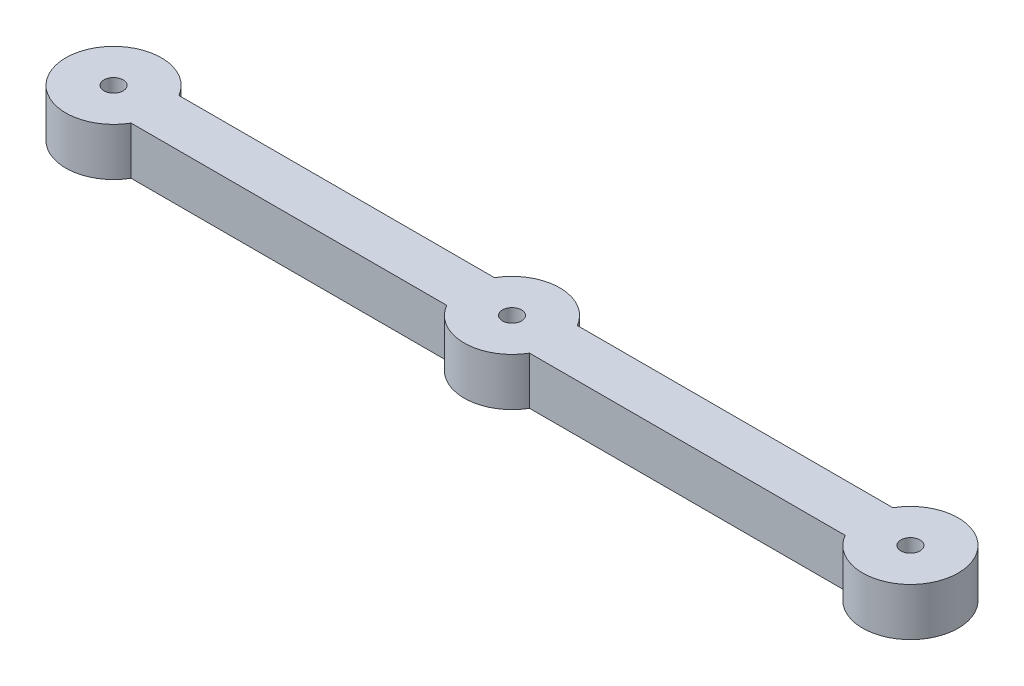
ISO-10303-21;
HEADER;
FILE_DESCRIPTION(('STEP AP214'),'2;1');
FILE_NAME('part.step','',(''),(''),'','','');
FILE_SCHEMA(('AUTOMOTIVE_DESIGN { 1 0 10303 214 1 1 1 1 }'));
ENDSEC;
DATA;
#1=APPLICATION_CONTEXT('core data for automotive mechanical design processes');
#2=APPLICATION_PROTOCOL_DEFINITION('international standard','automotive_design',2000,#1);
#3=PRODUCT_CONTEXT('',#1,'mechanical');
#4=PRODUCT('Part','Part','',(#3));
#5=PRODUCT_RELATED_PRODUCT_CATEGORY('part','',(#4));
#6=PRODUCT_DEFINITION_FORMATION('','',#4);
#7=PRODUCT_DEFINITION_CONTEXT('part definition',#1,'design');
#8=PRODUCT_DEFINITION('design','',#6,#7);
#9=PRODUCT_DEFINITION_SHAPE('','',#8);
#10=(LENGTH_UNIT() NAMED_UNIT(*) SI_UNIT(.MILLI.,.METRE.));
#11=(NAMED_UNIT(*) PLANE_ANGLE_UNIT() SI_UNIT($,.RADIAN.));
#12=(NAMED_UNIT(*) SI_UNIT($,.STERADIAN.) SOLID_ANGLE_UNIT());
#13=UNCERTAINTY_MEASURE_WITH_UNIT(LENGTH_MEASURE(1.E-05),#10,'distance_accuracy_value','');
#14=(GEOMETRIC_REPRESENTATION_CONTEXT(3) GLOBAL_UNCERTAINTY_ASSIGNED_CONTEXT((#13)) GLOBAL_UNIT_ASSIGNED_CONTEXT((#10,
#11,#12)) REPRESENTATION_CONTEXT('',''));
#15=CARTESIAN_POINT('',(0.,0.,0.));
#16=DIRECTION('',(0.,0.,1.));
#17=DIRECTION('',(1.,0.,0.));
#18=AXIS2_PLACEMENT_3D('',#15,#16,#17);
#19=CARTESIAN_POINT('',(-25.,0.,0.));
#20=DIRECTION('',(0.,1.,0.));
#21=DIRECTION('',(0.,0.,1.));
#22=AXIS2_PLACEMENT_3D('',#19,#20,#21);
#23=PLANE('',#22);
#24=CARTESIAN_POINT('',(-25.,0.,0.));
#25=DIRECTION('',(0.,-1.,0.));
#26=DIRECTION('',(0.,0.,-1.));
#27=AXIS2_PLACEMENT_3D('',#24,#25,#26);
#28=CIRCLE('',#27,1.5);
#29=CARTESIAN_POINT('',(-25.,0.,-1.5));
#30=VERTEX_POINT('',#29);
#31=EDGE_CURVE('E236',#30,#30,#28,.T.);
#32=ORIENTED_EDGE('',*,*,#31,.F.);
#33=EDGE_LOOP('',(#32));
#34=FACE_BOUND('',#33,.T.);
#35=CARTESIAN_POINT('',(0.,0.,0.));
#36=DIRECTION('',(0.,-1.,0.));
#37=DIRECTION('',(0.,0.,-1.));
#38=AXIS2_PLACEMENT_3D('',#35,#36,#37);
#39=CIRCLE('',#38,1.5);
#40=CARTESIAN_POINT('',(0.,0.,-1.5));
#41=VERTEX_POINT('',#40);
#42=EDGE_CURVE('E233',#41,#41,#39,.T.);
#43=ORIENTED_EDGE('',*,*,#42,.F.);
#44=EDGE_LOOP('',(#43));
#45=FACE_BOUND('',#44,.T.);
#46=CARTESIAN_POINT('',(25.,0.,0.));
#47=DIRECTION('',(0.,-1.,0.));
#48=DIRECTION('',(0.,0.,-1.));
#49=AXIS2_PLACEMENT_3D('',#46,#47,#48);
#50=CIRCLE('',#49,1.5);
#51=CARTESIAN_POINT('',(25.,0.,-1.5));
#52=VERTEX_POINT('',#51);
#53=EDGE_CURVE('E224',#52,#52,#50,.T.);
#54=ORIENTED_EDGE('',*,*,#53,.F.);
#55=EDGE_LOOP('',(#54));
#56=FACE_BOUND('',#55,.T.);
#57=CARTESIAN_POINT('',(25.,0.,0.));
#58=DIRECTION('',(0.,1.,0.));
#59=DIRECTION('',(0.,0.,1.));
#60=AXIS2_PLACEMENT_3D('',#57,#58,#59);
#61=CIRCLE('',#60,3.);
#62=CARTESIAN_POINT('',(22.4019237886467,0.,1.5));
#63=VERTEX_POINT('',#62);
#64=CARTESIAN_POINT('',(22.4019237886467,0.,-1.5));
#65=VERTEX_POINT('',#64);
#66=EDGE_CURVE('E202',#63,#65,#61,.T.);
#67=ORIENTED_EDGE('',*,*,#66,.F.);
#68=DIRECTION('',(1.,0.,0.));
#69=VECTOR('',#68,1.);
#70=CARTESIAN_POINT('',(-25.,0.,1.5));
#71=LINE('',#70,#69);
#72=CARTESIAN_POINT('',(2.59807621135332,0.,1.5));
#73=VERTEX_POINT('',#72);
#74=EDGE_CURVE('E190',#73,#63,#71,.T.);
#75=ORIENTED_EDGE('',*,*,#74,.F.);
#76=CARTESIAN_POINT('',(0.,0.,0.));
#77=DIRECTION('',(0.,1.,0.));
#78=DIRECTION('',(0.,0.,1.));
#79=AXIS2_PLACEMENT_3D('',#76,#77,#78);
#80=CIRCLE('',#79,3.);
#81=CARTESIAN_POINT('',(-2.59807621135332,0.,1.5));
#82=VERTEX_POINT('',#81);
#83=EDGE_CURVE('E197',#82,#73,#80,.T.);
#84=ORIENTED_EDGE('',*,*,#83,.F.);
#85=CARTESIAN_POINT('',(-22.4019237886467,0.,1.5));
#86=VERTEX_POINT('',#85);
#87=EDGE_CURVE('E177',#86,#82,#71,.T.);
#88=ORIENTED_EDGE('',*,*,#87,.F.);
#89=CARTESIAN_POINT('',(-25.,0.,0.));
#90=DIRECTION('',(0.,1.,0.));
#91=DIRECTION('',(0.,0.,1.));
#92=AXIS2_PLACEMENT_3D('',#89,#90,#91);
#93=CIRCLE('',#92,3.);
#94=CARTESIAN_POINT('',(-22.4019237886467,0.,-1.5));
#95=VERTEX_POINT('',#94);
#96=EDGE_CURVE('E160',#95,#86,#93,.T.);
#97=ORIENTED_EDGE('',*,*,#96,.F.);
#98=DIRECTION('',(1.,0.,0.));
#99=VECTOR('',#98,1.);
#100=CARTESIAN_POINT('',(-25.,0.,-1.5));
#101=LINE('',#100,#99);
#102=CARTESIAN_POINT('',(-2.59807621135332,0.,-1.5));
#103=VERTEX_POINT('',#102);
#104=EDGE_CURVE('E165',#95,#103,#101,.T.);
#105=ORIENTED_EDGE('',*,*,#104,.T.);
#106=CARTESIAN_POINT('',(2.59807621135332,0.,-1.5));
#107=VERTEX_POINT('',#106);
#108=EDGE_CURVE('E196',#107,#103,#80,.T.);
#109=ORIENTED_EDGE('',*,*,#108,.F.);
#110=EDGE_CURVE('E173',#107,#65,#101,.T.);
#111=ORIENTED_EDGE('',*,*,#110,.T.);
#112=EDGE_LOOP('',(#67,#75,#84,#88,#97,#105,#109,#111));
#113=FACE_BOUND('',#112,.T.);
#114=ADVANCED_FACE('F84',(#34,#45,#56,#113),#23,.F.);
#115=CARTESIAN_POINT('',(-25.,3.,0.));
#116=DIRECTION('',(0.,1.,0.));
#117=DIRECTION('',(0.,0.,1.));
#118=AXIS2_PLACEMENT_3D('',#115,#116,#117);
#119=PLANE('',#118);
#120=CARTESIAN_POINT('',(-25.,3.,0.));
#121=DIRECTION('',(0.,-1.,0.));
#122=DIRECTION('',(0.,0.,-1.));
#123=AXIS2_PLACEMENT_3D('',#120,#121,#122);
#124=CIRCLE('',#123,0.6);
#125=CARTESIAN_POINT('',(-25.,3.,-0.6));
#126=VERTEX_POINT('',#125);
#127=EDGE_CURVE('E244',#126,#126,#124,.T.);
#128=ORIENTED_EDGE('',*,*,#127,.T.);
#129=EDGE_LOOP('',(#128));
#130=FACE_BOUND('',#129,.T.);
#131=CARTESIAN_POINT('',(25.,3.,0.));
#132=DIRECTION('',(0.,-1.,0.));
#133=DIRECTION('',(0.,0.,-1.));
#134=AXIS2_PLACEMENT_3D('',#131,#132,#133);
#135=CIRCLE('',#134,0.6);
#136=CARTESIAN_POINT('',(25.,3.,-0.6));
#137=VERTEX_POINT('',#136);
#138=EDGE_CURVE('E243',#137,#137,#135,.T.);
#139=ORIENTED_EDGE('',*,*,#138,.T.);
#140=EDGE_LOOP('',(#139));
#141=FACE_BOUND('',#140,.T.);
#142=CARTESIAN_POINT('',(0.,3.,0.));
#143=DIRECTION('',(0.,-1.,0.));
#144=DIRECTION('',(0.,0.,-1.));
#145=AXIS2_PLACEMENT_3D('',#142,#143,#144);
#146=CIRCLE('',#145,0.6);
#147=CARTESIAN_POINT('',(0.,3.,-0.6));
#148=VERTEX_POINT('',#147);
#149=EDGE_CURVE('E215',#148,#148,#146,.T.);
#150=ORIENTED_EDGE('',*,*,#149,.T.);
#151=EDGE_LOOP('',(#150));
#152=FACE_BOUND('',#151,.T.);
#153=DIRECTION('',(1.,0.,0.));
#154=VECTOR('',#153,1.);
#155=CARTESIAN_POINT('',(-25.,3.,1.5));
#156=LINE('',#155,#154);
#157=CARTESIAN_POINT('',(2.59807621135332,3.,1.5));
#158=VERTEX_POINT('',#157);
#159=CARTESIAN_POINT('',(22.4019237886467,3.,1.5));
#160=VERTEX_POINT('',#159);
#161=EDGE_CURVE('E172',#158,#160,#156,.T.);
#162=ORIENTED_EDGE('',*,*,#161,.T.);
#163=CARTESIAN_POINT('',(25.,3.,0.));
#164=DIRECTION('',(0.,1.,0.));
#165=DIRECTION('',(0.,0.,1.));
#166=AXIS2_PLACEMENT_3D('',#163,#164,#165);
#167=CIRCLE('',#166,3.);
#168=CARTESIAN_POINT('',(22.4019237886467,3.,-1.5));
#169=VERTEX_POINT('',#168);
#170=EDGE_CURVE('E200',#160,#169,#167,.T.);
#171=ORIENTED_EDGE('',*,*,#170,.T.);
#172=DIRECTION('',(1.,0.,0.));
#173=VECTOR('',#172,1.);
#174=CARTESIAN_POINT('',(-25.,3.,-1.5));
#175=LINE('',#174,#173);
#176=CARTESIAN_POINT('',(2.59807621135332,3.,-1.5));
#177=VERTEX_POINT('',#176);
#178=EDGE_CURVE('E187',#177,#169,#175,.T.);
#179=ORIENTED_EDGE('',*,*,#178,.F.);
#180=CARTESIAN_POINT('',(0.,3.,0.));
#181=DIRECTION('',(0.,1.,0.));
#182=DIRECTION('',(0.,0.,1.));
#183=AXIS2_PLACEMENT_3D('',#180,#181,#182);
#184=CIRCLE('',#183,3.);
#185=CARTESIAN_POINT('',(-2.59807621135332,3.,-1.5));
#186=VERTEX_POINT('',#185);
#187=EDGE_CURVE('E195',#177,#186,#184,.T.);
#188=ORIENTED_EDGE('',*,*,#187,.T.);
#189=CARTESIAN_POINT('',(-22.4019237886467,3.,-1.5));
#190=VERTEX_POINT('',#189);
#191=EDGE_CURVE('E188',#190,#186,#175,.T.);
#192=ORIENTED_EDGE('',*,*,#191,.F.);
#193=CARTESIAN_POINT('',(-25.,3.,0.));
#194=DIRECTION('',(0.,1.,0.));
#195=DIRECTION('',(0.,0.,1.));
#196=AXIS2_PLACEMENT_3D('',#193,#194,#195);
#197=CIRCLE('',#196,3.);
#198=CARTESIAN_POINT('',(-22.4019237886467,3.,1.5));
#199=VERTEX_POINT('',#198);
#200=EDGE_CURVE('E162',#190,#199,#197,.T.);
#201=ORIENTED_EDGE('',*,*,#200,.T.);
#202=CARTESIAN_POINT('',(-2.59807621135332,3.,1.5));
#203=VERTEX_POINT('',#202);
#204=EDGE_CURVE('E185',#199,#203,#156,.T.);
#205=ORIENTED_EDGE('',*,*,#204,.T.);
#206=EDGE_CURVE('E192',#203,#158,#184,.T.);
#207=ORIENTED_EDGE('',*,*,#206,.T.);
#208=EDGE_LOOP('',(#162,#171,#179,#188,#192,#201,#205,#207));
#209=FACE_BOUND('',#208,.T.);
#210=ADVANCED_FACE('F250',(#130,#141,#152,#209),#119,.T.);
#211=CARTESIAN_POINT('',(-25.,3.,0.));
#212=DIRECTION('',(0.,-1.,0.));
#213=DIRECTION('',(0.,0.,-1.));
#214=AXIS2_PLACEMENT_3D('',#211,#212,#213);
#215=CYLINDRICAL_SURFACE('',#214,3.);
#216=DIRECTION('',(0.,-1.,0.));
#217=VECTOR('',#216,1.);
#218=CARTESIAN_POINT('',(-22.4019237886467,3.,1.5));
#219=LINE('',#218,#217);
#220=EDGE_CURVE('E12',#199,#86,#219,.T.);
#221=ORIENTED_EDGE('',*,*,#220,.F.);
#222=ORIENTED_EDGE('',*,*,#200,.F.);
#223=DIRECTION('',(0.,-1.,0.));
#224=VECTOR('',#223,1.);
#225=CARTESIAN_POINT('',(-22.4019237886467,3.,-1.5));
#226=LINE('',#225,#224);
#227=EDGE_CURVE('E94',#190,#95,#226,.T.);
#228=ORIENTED_EDGE('',*,*,#227,.T.);
#229=ORIENTED_EDGE('',*,*,#96,.T.);
#230=EDGE_LOOP('',(#221,#222,#228,#229));
#231=FACE_BOUND('',#230,.T.);
#232=ADVANCED_FACE('F158',(#231),#215,.T.);
#233=CARTESIAN_POINT('',(25.,3.,0.));
#234=DIRECTION('',(0.,-1.,0.));
#235=DIRECTION('',(0.,0.,-1.));
#236=AXIS2_PLACEMENT_3D('',#233,#234,#235);
#237=CYLINDRICAL_SURFACE('',#236,3.);
#238=ORIENTED_EDGE('',*,*,#170,.F.);
#239=DIRECTION('',(0.,-1.,0.));
#240=VECTOR('',#239,1.);
#241=CARTESIAN_POINT('',(22.4019237886467,3.,1.5));
#242=LINE('',#241,#240);
#243=EDGE_CURVE('E206',#160,#63,#242,.T.);
#244=ORIENTED_EDGE('',*,*,#243,.T.);
#245=ORIENTED_EDGE('',*,*,#66,.T.);
#246=DIRECTION('',(0.,-1.,0.));
#247=VECTOR('',#246,1.);
#248=CARTESIAN_POINT('',(22.4019237886467,3.,-1.5));
#249=LINE('',#248,#247);
#250=EDGE_CURVE('E149',#169,#65,#249,.T.);
#251=ORIENTED_EDGE('',*,*,#250,.F.);
#252=EDGE_LOOP('',(#238,#244,#245,#251));
#253=FACE_BOUND('',#252,.T.);
#254=ADVANCED_FACE('F86',(#253),#237,.T.);
#255=CARTESIAN_POINT('',(-25.,3.,1.5));
#256=DIRECTION('',(0.,0.,-1.));
#257=DIRECTION('',(-1.,0.,0.));
#258=AXIS2_PLACEMENT_3D('',#255,#256,#257);
#259=PLANE('',#258);
#260=DIRECTION('',(0.,-1.,0.));
#261=VECTOR('',#260,1.);
#262=CARTESIAN_POINT('',(2.59807621135332,3.,1.5));
#263=LINE('',#262,#261);
#264=EDGE_CURVE('E178',#73,#158,#263,.F.);
#265=ORIENTED_EDGE('',*,*,#264,.F.);
#266=ORIENTED_EDGE('',*,*,#74,.T.);
#267=ORIENTED_EDGE('',*,*,#243,.F.);
#268=ORIENTED_EDGE('',*,*,#161,.F.);
#269=EDGE_LOOP('',(#265,#266,#267,#268));
#270=FACE_BOUND('',#269,.T.);
#271=ADVANCED_FACE('F269',(#270),#259,.F.);
#272=CARTESIAN_POINT('',(-25.,3.,-1.5));
#273=DIRECTION('',(0.,0.,-1.));
#274=DIRECTION('',(-1.,0.,0.));
#275=AXIS2_PLACEMENT_3D('',#272,#273,#274);
#276=PLANE('',#275);
#277=ORIENTED_EDGE('',*,*,#110,.F.);
#278=DIRECTION('',(0.,-1.,0.));
#279=VECTOR('',#278,1.);
#280=CARTESIAN_POINT('',(2.59807621135332,3.,-1.5));
#281=LINE('',#280,#279);
#282=EDGE_CURVE('E142',#107,#177,#281,.F.);
#283=ORIENTED_EDGE('',*,*,#282,.T.);
#284=ORIENTED_EDGE('',*,*,#178,.T.);
#285=ORIENTED_EDGE('',*,*,#250,.T.);
#286=EDGE_LOOP('',(#277,#283,#284,#285));
#287=FACE_BOUND('',#286,.T.);
#288=ADVANCED_FACE('F294',(#287),#276,.T.);
#289=CARTESIAN_POINT('',(0.,3.,0.));
#290=DIRECTION('',(0.,-1.,0.));
#291=DIRECTION('',(0.,0.,-1.));
#292=AXIS2_PLACEMENT_3D('',#289,#290,#291);
#293=CYLINDRICAL_SURFACE('',#292,3.);
#294=ORIENTED_EDGE('',*,*,#83,.T.);
#295=ORIENTED_EDGE('',*,*,#264,.T.);
#296=ORIENTED_EDGE('',*,*,#206,.F.);
#297=DIRECTION('',(0.,-1.,0.));
#298=VECTOR('',#297,1.);
#299=CARTESIAN_POINT('',(-2.59807621135332,3.,1.5));
#300=LINE('',#299,#298);
#301=EDGE_CURVE('E181',#203,#82,#300,.T.);
#302=ORIENTED_EDGE('',*,*,#301,.T.);
#303=EDGE_LOOP('',(#294,#295,#296,#302));
#304=FACE_BOUND('',#303,.T.);
#305=ADVANCED_FACE('F270',(#304),#293,.T.);
#306=ORIENTED_EDGE('',*,*,#282,.F.);
#307=ORIENTED_EDGE('',*,*,#108,.T.);
#308=DIRECTION('',(0.,-1.,0.));
#309=VECTOR('',#308,1.);
#310=CARTESIAN_POINT('',(-2.59807621135332,3.,-1.5));
#311=LINE('',#310,#309);
#312=EDGE_CURVE('E168',#186,#103,#311,.T.);
#313=ORIENTED_EDGE('',*,*,#312,.F.);
#314=ORIENTED_EDGE('',*,*,#187,.F.);
#315=EDGE_LOOP('',(#306,#307,#313,#314));
#316=FACE_BOUND('',#315,.T.);
#317=ADVANCED_FACE('F275',(#316),#293,.T.);
#318=ORIENTED_EDGE('',*,*,#227,.F.);
#319=ORIENTED_EDGE('',*,*,#191,.T.);
#320=ORIENTED_EDGE('',*,*,#312,.T.);
#321=ORIENTED_EDGE('',*,*,#104,.F.);
#322=EDGE_LOOP('',(#318,#319,#320,#321));
#323=FACE_BOUND('',#322,.T.);
#324=ADVANCED_FACE('F166',(#323),#276,.T.);
#325=ORIENTED_EDGE('',*,*,#204,.F.);
#326=ORIENTED_EDGE('',*,*,#220,.T.);
#327=ORIENTED_EDGE('',*,*,#87,.T.);
#328=ORIENTED_EDGE('',*,*,#301,.F.);
#329=EDGE_LOOP('',(#325,#326,#327,#328));
#330=FACE_BOUND('',#329,.T.);
#331=ADVANCED_FACE('F280',(#330),#259,.F.);
#332=CARTESIAN_POINT('',(25.,1.2,0.));
#333=DIRECTION('',(0.,-1.,0.));
#334=DIRECTION('',(0.,0.,-1.));
#335=AXIS2_PLACEMENT_3D('',#332,#333,#334);
#336=CYLINDRICAL_SURFACE('',#335,1.5);
#337=CARTESIAN_POINT('',(25.,1.2,0.));
#338=DIRECTION('',(0.,-1.,0.));
#339=DIRECTION('',(0.,0.,-1.));
#340=AXIS2_PLACEMENT_3D('',#337,#338,#339);
#341=CIRCLE('',#340,1.5);
#342=CARTESIAN_POINT('',(25.,1.2,-1.5));
#343=VERTEX_POINT('',#342);
#344=EDGE_CURVE('E220',#343,#343,#341,.T.);
#345=ORIENTED_EDGE('',*,*,#344,.F.);
#346=EDGE_LOOP('',(#345));
#347=FACE_BOUND('',#346,.T.);
#348=ORIENTED_EDGE('',*,*,#53,.T.);
#349=EDGE_LOOP('',(#348));
#350=FACE_BOUND('',#349,.T.);
#351=ADVANCED_FACE('F274',(#347,#350),#336,.F.);
#352=CARTESIAN_POINT('',(25.,1.2,0.));
#353=DIRECTION('',(0.,-1.,0.));
#354=DIRECTION('',(0.,0.,-1.));
#355=AXIS2_PLACEMENT_3D('',#352,#353,#354);
#356=PLANE('',#355);
#357=CARTESIAN_POINT('',(25.,1.2,0.));
#358=DIRECTION('',(0.,-1.,0.));
#359=DIRECTION('',(0.,0.,-1.));
#360=AXIS2_PLACEMENT_3D('',#357,#358,#359);
#361=CIRCLE('',#360,0.6);
#362=CARTESIAN_POINT('',(25.,1.2,-0.6));
#363=VERTEX_POINT('',#362);
#364=EDGE_CURVE('E88',#363,#363,#361,.T.);
#365=ORIENTED_EDGE('',*,*,#364,.F.);
#366=EDGE_LOOP('',(#365));
#367=FACE_BOUND('',#366,.T.);
#368=ORIENTED_EDGE('',*,*,#344,.T.);
#369=EDGE_LOOP('',(#368));
#370=FACE_BOUND('',#369,.T.);
#371=ADVANCED_FACE('F291',(#367,#370),#356,.T.);
#372=CARTESIAN_POINT('',(0.,1.2,0.));
#373=DIRECTION('',(0.,-1.,0.));
#374=DIRECTION('',(0.,0.,-1.));
#375=AXIS2_PLACEMENT_3D('',#372,#373,#374);
#376=CYLINDRICAL_SURFACE('',#375,1.5);
#377=CARTESIAN_POINT('',(0.,1.2,0.));
#378=DIRECTION('',(0.,-1.,0.));
#379=DIRECTION('',(0.,0.,-1.));
#380=AXIS2_PLACEMENT_3D('',#377,#378,#379);
#381=CIRCLE('',#380,1.5);
#382=CARTESIAN_POINT('',(0.,1.2,-1.5));
#383=VERTEX_POINT('',#382);
#384=EDGE_CURVE('E228',#383,#383,#381,.T.);
#385=ORIENTED_EDGE('',*,*,#384,.F.);
#386=EDGE_LOOP('',(#385));
#387=FACE_BOUND('',#386,.T.);
#388=ORIENTED_EDGE('',*,*,#42,.T.);
#389=EDGE_LOOP('',(#388));
#390=FACE_BOUND('',#389,.T.);
#391=ADVANCED_FACE('F370',(#387,#390),#376,.F.);
#392=CARTESIAN_POINT('',(0.,1.2,0.));
#393=DIRECTION('',(0.,-1.,0.));
#394=DIRECTION('',(0.,0.,-1.));
#395=AXIS2_PLACEMENT_3D('',#392,#393,#394);
#396=PLANE('',#395);
#397=CARTESIAN_POINT('',(0.,1.2,0.));
#398=DIRECTION('',(0.,-1.,0.));
#399=DIRECTION('',(0.,0.,-1.));
#400=AXIS2_PLACEMENT_3D('',#397,#398,#399);
#401=CIRCLE('',#400,0.6);
#402=CARTESIAN_POINT('',(0.,1.2,-0.6));
#403=VERTEX_POINT('',#402);
#404=EDGE_CURVE('E214',#403,#403,#401,.T.);
#405=ORIENTED_EDGE('',*,*,#404,.F.);
#406=EDGE_LOOP('',(#405));
#407=FACE_BOUND('',#406,.T.);
#408=ORIENTED_EDGE('',*,*,#384,.T.);
#409=EDGE_LOOP('',(#408));
#410=FACE_BOUND('',#409,.T.);
#411=ADVANCED_FACE('F375',(#407,#410),#396,.T.);
#412=CARTESIAN_POINT('',(-25.,1.2,0.));
#413=DIRECTION('',(0.,-1.,0.));
#414=DIRECTION('',(0.,0.,-1.));
#415=AXIS2_PLACEMENT_3D('',#412,#413,#414);
#416=CYLINDRICAL_SURFACE('',#415,1.5);
#417=CARTESIAN_POINT('',(-25.,1.2,0.));
#418=DIRECTION('',(0.,-1.,0.));
#419=DIRECTION('',(0.,0.,-1.));
#420=AXIS2_PLACEMENT_3D('',#417,#418,#419);
#421=CIRCLE('',#420,1.5);
#422=CARTESIAN_POINT('',(-25.,1.2,-1.5));
#423=VERTEX_POINT('',#422);
#424=EDGE_CURVE('E204',#423,#423,#421,.T.);
#425=ORIENTED_EDGE('',*,*,#424,.F.);
#426=EDGE_LOOP('',(#425));
#427=FACE_BOUND('',#426,.T.);
#428=ORIENTED_EDGE('',*,*,#31,.T.);
#429=EDGE_LOOP('',(#428));
#430=FACE_BOUND('',#429,.T.);
#431=ADVANCED_FACE('F384',(#427,#430),#416,.F.);
#432=CARTESIAN_POINT('',(-25.,1.2,0.));
#433=DIRECTION('',(0.,-1.,0.));
#434=DIRECTION('',(0.,0.,-1.));
#435=AXIS2_PLACEMENT_3D('',#432,#433,#434);
#436=PLANE('',#435);
#437=CARTESIAN_POINT('',(-25.,1.2,0.));
#438=DIRECTION('',(0.,-1.,0.));
#439=DIRECTION('',(0.,0.,-1.));
#440=AXIS2_PLACEMENT_3D('',#437,#438,#439);
#441=CIRCLE('',#440,0.6);
#442=CARTESIAN_POINT('',(-25.,1.2,-0.6));
#443=VERTEX_POINT('',#442);
#444=EDGE_CURVE('E212',#443,#443,#441,.T.);
#445=ORIENTED_EDGE('',*,*,#444,.F.);
#446=EDGE_LOOP('',(#445));
#447=FACE_BOUND('',#446,.T.);
#448=ORIENTED_EDGE('',*,*,#424,.T.);
#449=EDGE_LOOP('',(#448));
#450=FACE_BOUND('',#449,.T.);
#451=ADVANCED_FACE('F388',(#447,#450),#436,.T.);
#452=CARTESIAN_POINT('',(-25.,3.,0.));
#453=DIRECTION('',(0.,-1.,0.));
#454=DIRECTION('',(0.,0.,-1.));
#455=AXIS2_PLACEMENT_3D('',#452,#453,#454);
#456=CYLINDRICAL_SURFACE('',#455,0.6);
#457=ORIENTED_EDGE('',*,*,#444,.T.);
#458=EDGE_LOOP('',(#457));
#459=FACE_BOUND('',#458,.T.);
#460=ORIENTED_EDGE('',*,*,#127,.F.);
#461=EDGE_LOOP('',(#460));
#462=FACE_BOUND('',#461,.T.);
#463=ADVANCED_FACE('F260',(#459,#462),#456,.F.);
#464=CARTESIAN_POINT('',(0.,3.,0.));
#465=DIRECTION('',(0.,-1.,0.));
#466=DIRECTION('',(0.,0.,-1.));
#467=AXIS2_PLACEMENT_3D('',#464,#465,#466);
#468=CYLINDRICAL_SURFACE('',#467,0.6);
#469=ORIENTED_EDGE('',*,*,#404,.T.);
#470=EDGE_LOOP('',(#469));
#471=FACE_BOUND('',#470,.T.);
#472=ORIENTED_EDGE('',*,*,#149,.F.);
#473=EDGE_LOOP('',(#472));
#474=FACE_BOUND('',#473,.T.);
#475=ADVANCED_FACE('F255',(#471,#474),#468,.F.);
#476=CARTESIAN_POINT('',(25.,3.,0.));
#477=DIRECTION('',(0.,-1.,0.));
#478=DIRECTION('',(0.,0.,-1.));
#479=AXIS2_PLACEMENT_3D('',#476,#477,#478);
#480=CYLINDRICAL_SURFACE('',#479,0.6);
#481=ORIENTED_EDGE('',*,*,#364,.T.);
#482=EDGE_LOOP('',(#481));
#483=FACE_BOUND('',#482,.T.);
#484=ORIENTED_EDGE('',*,*,#138,.F.);
#485=EDGE_LOOP('',(#484));
#486=FACE_BOUND('',#485,.T.);
#487=ADVANCED_FACE('F253',(#483,#486),#480,.F.);
#488=CLOSED_SHELL('',(#114,#210,#232,#254,#271,#288,#305,#317,#324,#331,#351,#371,#391,#411,
#431,#451,#463,#475,#487));
#489=MANIFOLD_SOLID_BREP('B2',#488);
#490=ADVANCED_BREP_SHAPE_REPRESENTATION('',(#18,#489),#14);
#491=SHAPE_DEFINITION_REPRESENTATION(#9,#490);
ENDSEC;
END-ISO-10303-21;
